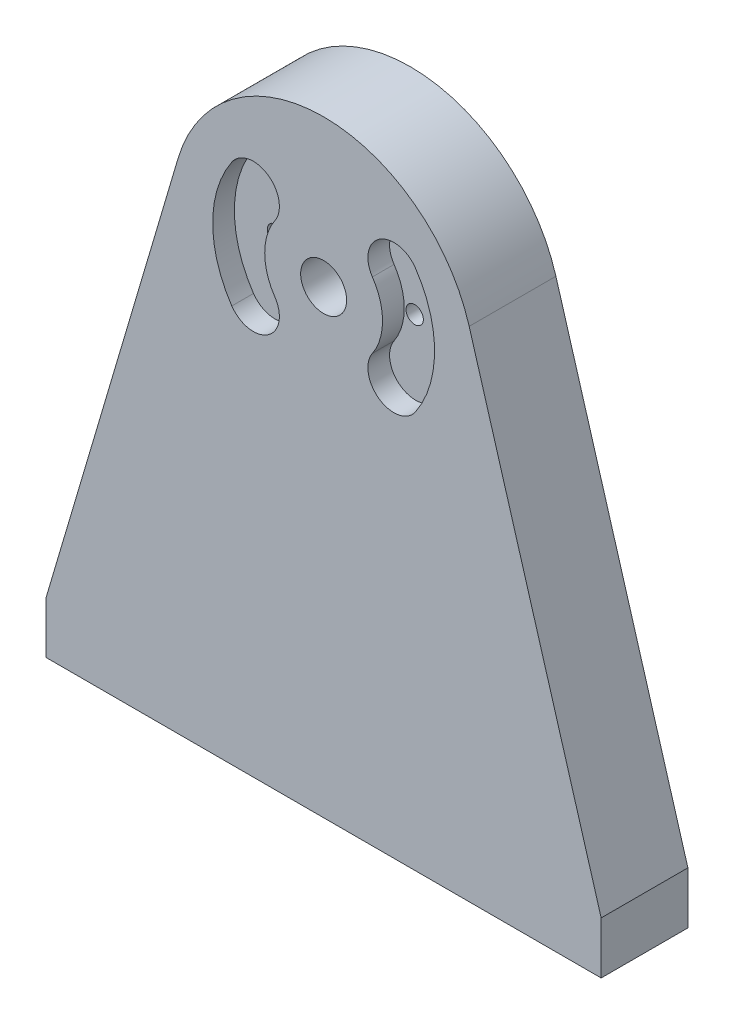
ISO-10303-21;
HEADER;
FILE_DESCRIPTION(('STEP AP214'),'2;1');
FILE_NAME('part.step','',(''),(''),'','','');
FILE_SCHEMA(('AUTOMOTIVE_DESIGN { 1 0 10303 214 1 1 1 1 }'));
ENDSEC;
DATA;
#1=APPLICATION_CONTEXT('core data for automotive mechanical design processes');
#2=APPLICATION_PROTOCOL_DEFINITION('international standard','automotive_design',2000,#1);
#3=PRODUCT_CONTEXT('',#1,'mechanical');
#4=PRODUCT('Part','Part','',(#3));
#5=PRODUCT_RELATED_PRODUCT_CATEGORY('part','',(#4));
#6=PRODUCT_DEFINITION_FORMATION('','',#4);
#7=PRODUCT_DEFINITION_CONTEXT('part definition',#1,'design');
#8=PRODUCT_DEFINITION('design','',#6,#7);
#9=PRODUCT_DEFINITION_SHAPE('','',#8);
#10=(LENGTH_UNIT() NAMED_UNIT(*) SI_UNIT(.MILLI.,.METRE.));
#11=(NAMED_UNIT(*) PLANE_ANGLE_UNIT() SI_UNIT($,.RADIAN.));
#12=(NAMED_UNIT(*) SI_UNIT($,.STERADIAN.) SOLID_ANGLE_UNIT());
#13=UNCERTAINTY_MEASURE_WITH_UNIT(LENGTH_MEASURE(1.E-05),#10,'distance_accuracy_value','');
#14=(GEOMETRIC_REPRESENTATION_CONTEXT(3) GLOBAL_UNCERTAINTY_ASSIGNED_CONTEXT((#13)) GLOBAL_UNIT_ASSIGNED_CONTEXT((#10,
#11,#12)) REPRESENTATION_CONTEXT('',''));
#15=CARTESIAN_POINT('',(0.,0.,0.));
#16=DIRECTION('',(0.,0.,1.));
#17=DIRECTION('',(1.,0.,0.));
#18=AXIS2_PLACEMENT_3D('',#15,#16,#17);
#19=CARTESIAN_POINT('',(0.,52.5,5.));
#20=DIRECTION('',(0.,0.,1.));
#21=DIRECTION('',(1.,0.,0.));
#22=AXIS2_PLACEMENT_3D('',#19,#20,#21);
#23=PLANE('',#22);
#24=CARTESIAN_POINT('',(-8.10334356909827,58.5,5.));
#25=DIRECTION('',(0.,0.,1.));
#26=DIRECTION('',(1.,0.,0.));
#27=AXIS2_PLACEMENT_3D('',#24,#25,#26);
#28=CIRCLE('',#27,3.);
#29=CARTESIAN_POINT('',(-5.62110165243839,56.8152225466915,5.));
#30=VERTEX_POINT('',#29);
#31=CARTESIAN_POINT('',(-10.5855854857581,60.1847774533085,5.));
#32=VERTEX_POINT('',#31);
#33=EDGE_CURVE('E261',#30,#32,#28,.T.);
#34=ORIENTED_EDGE('',*,*,#33,.F.);
#35=CARTESIAN_POINT('',(0.,53.,5.));
#36=DIRECTION('',(0.,0.,-1.));
#37=DIRECTION('',(1.,0.,0.));
#38=AXIS2_PLACEMENT_3D('',#35,#36,#37);
#39=CIRCLE('',#38,6.79357835516959);
#40=CARTESIAN_POINT('',(-5.62110165243839,49.1847774533085,5.));
#41=VERTEX_POINT('',#40);
#42=EDGE_CURVE('E325',#41,#30,#39,.T.);
#43=ORIENTED_EDGE('',*,*,#42,.F.);
#44=CARTESIAN_POINT('',(-8.10334356909827,47.5,5.));
#45=DIRECTION('',(0.,0.,1.));
#46=DIRECTION('',(1.,0.,0.));
#47=AXIS2_PLACEMENT_3D('',#44,#45,#46);
#48=CIRCLE('',#47,3.);
#49=CARTESIAN_POINT('',(-10.5855854857581,45.8152225466915,5.));
#50=VERTEX_POINT('',#49);
#51=EDGE_CURVE('E323',#50,#41,#48,.T.);
#52=ORIENTED_EDGE('',*,*,#51,.F.);
#53=CARTESIAN_POINT('',(0.,53.,5.));
#54=DIRECTION('',(0.,0.,1.));
#55=DIRECTION('',(1.,0.,0.));
#56=AXIS2_PLACEMENT_3D('',#53,#54,#55);
#57=CIRCLE('',#56,12.7935783551696);
#58=EDGE_CURVE('E312',#32,#50,#57,.T.);
#59=ORIENTED_EDGE('',*,*,#58,.F.);
#60=EDGE_LOOP('',(#34,#43,#52,#59));
#61=FACE_BOUND('',#60,.T.);
#62=CARTESIAN_POINT('',(0.,53.,5.));
#63=DIRECTION('',(0.,0.,1.));
#64=DIRECTION('',(1.,0.,0.));
#65=AXIS2_PLACEMENT_3D('',#62,#63,#64);
#66=CIRCLE('',#65,2.65);
#67=CARTESIAN_POINT('',(2.65,53.,5.));
#68=VERTEX_POINT('',#67);
#69=EDGE_CURVE('E332',#68,#68,#66,.T.);
#70=ORIENTED_EDGE('',*,*,#69,.F.);
#71=EDGE_LOOP('',(#70));
#72=FACE_BOUND('',#71,.T.);
#73=DIRECTION('',(0.,-1.,0.));
#74=VECTOR('',#73,1.);
#75=CARTESIAN_POINT('',(-32.,0.,5.));
#76=LINE('',#75,#74);
#77=CARTESIAN_POINT('',(-32.,6.,5.));
#78=VERTEX_POINT('',#77);
#79=CARTESIAN_POINT('',(-32.,0.,5.));
#80=VERTEX_POINT('',#79);
#81=EDGE_CURVE('E244',#78,#80,#76,.T.);
#82=ORIENTED_EDGE('',*,*,#81,.T.);
#83=DIRECTION('',(1.,0.,0.));
#84=VECTOR('',#83,1.);
#85=CARTESIAN_POINT('',(-32.,0.,5.));
#86=LINE('',#85,#84);
#87=CARTESIAN_POINT('',(32.,0.,5.));
#88=VERTEX_POINT('',#87);
#89=EDGE_CURVE('E343',#80,#88,#86,.T.);
#90=ORIENTED_EDGE('',*,*,#89,.T.);
#91=DIRECTION('',(0.,1.,0.));
#92=VECTOR('',#91,1.);
#93=CARTESIAN_POINT('',(32.,0.,5.));
#94=LINE('',#93,#92);
#95=CARTESIAN_POINT('',(32.,6.,5.));
#96=VERTEX_POINT('',#95);
#97=EDGE_CURVE('E230',#88,#96,#94,.T.);
#98=ORIENTED_EDGE('',*,*,#97,.T.);
#99=DIRECTION('',(-0.283577938554677,0.958949191962265,0.));
#100=VECTOR('',#99,1.);
#101=CARTESIAN_POINT('',(32.,6.,5.));
#102=LINE('',#101,#100);
#103=CARTESIAN_POINT('',(16.7816108593396,57.4626139247069,5.));
#104=VERTEX_POINT('',#103);
#105=EDGE_CURVE('E346',#96,#104,#102,.T.);
#106=ORIENTED_EDGE('',*,*,#105,.T.);
#107=CARTESIAN_POINT('',(0.,52.5,5.));
#108=DIRECTION('',(0.,0.,1.));
#109=DIRECTION('',(1.,0.,0.));
#110=AXIS2_PLACEMENT_3D('',#107,#108,#109);
#111=CIRCLE('',#110,17.5);
#112=CARTESIAN_POINT('',(-16.7816108593396,57.4626139247069,5.));
#113=VERTEX_POINT('',#112);
#114=EDGE_CURVE('E348',#104,#113,#111,.T.);
#115=ORIENTED_EDGE('',*,*,#114,.T.);
#116=DIRECTION('',(-0.283577938554677,-0.958949191962265,0.));
#117=VECTOR('',#116,1.);
#118=CARTESIAN_POINT('',(-32.,6.,5.));
#119=LINE('',#118,#117);
#120=EDGE_CURVE('E249',#113,#78,#119,.T.);
#121=ORIENTED_EDGE('',*,*,#120,.T.);
#122=EDGE_LOOP('',(#82,#90,#98,#106,#115,#121));
#123=FACE_BOUND('',#122,.T.);
#124=CARTESIAN_POINT('',(0.,53.,5.));
#125=DIRECTION('',(0.,0.,1.));
#126=DIRECTION('',(-1.,0.,0.));
#127=AXIS2_PLACEMENT_3D('',#124,#125,#126);
#128=CIRCLE('',#127,6.79357835516959);
#129=CARTESIAN_POINT('',(5.62110165243839,49.1847774533085,5.));
#130=VERTEX_POINT('',#129);
#131=CARTESIAN_POINT('',(5.62110165243839,56.8152225466915,5.));
#132=VERTEX_POINT('',#131);
#133=EDGE_CURVE('E364',#130,#132,#128,.T.);
#134=ORIENTED_EDGE('',*,*,#133,.T.);
#135=CARTESIAN_POINT('',(8.10334356909827,58.5,5.));
#136=DIRECTION('',(0.,0.,-1.));
#137=DIRECTION('',(-1.,0.,0.));
#138=AXIS2_PLACEMENT_3D('',#135,#136,#137);
#139=CIRCLE('',#138,3.);
#140=CARTESIAN_POINT('',(10.5855854857581,60.1847774533085,5.));
#141=VERTEX_POINT('',#140);
#142=EDGE_CURVE('E265',#132,#141,#139,.T.);
#143=ORIENTED_EDGE('',*,*,#142,.T.);
#144=CARTESIAN_POINT('',(0.,53.,5.));
#145=DIRECTION('',(0.,0.,-1.));
#146=DIRECTION('',(-1.,0.,0.));
#147=AXIS2_PLACEMENT_3D('',#144,#145,#146);
#148=CIRCLE('',#147,12.7935783551696);
#149=CARTESIAN_POINT('',(10.5855854857581,45.8152225466915,5.));
#150=VERTEX_POINT('',#149);
#151=EDGE_CURVE('E372',#141,#150,#148,.T.);
#152=ORIENTED_EDGE('',*,*,#151,.T.);
#153=CARTESIAN_POINT('',(8.10334356909827,47.5,5.));
#154=DIRECTION('',(0.,0.,-1.));
#155=DIRECTION('',(-1.,0.,0.));
#156=AXIS2_PLACEMENT_3D('',#153,#154,#155);
#157=CIRCLE('',#156,3.);
#158=EDGE_CURVE('E367',#150,#130,#157,.T.);
#159=ORIENTED_EDGE('',*,*,#158,.T.);
#160=EDGE_LOOP('',(#134,#143,#152,#159));
#161=FACE_BOUND('',#160,.T.);
#162=ADVANCED_FACE('F32',(#61,#72,#123,#161),#23,.T.);
#163=CARTESIAN_POINT('',(-32.,0.,5.));
#164=DIRECTION('',(1.,0.,0.));
#165=DIRECTION('',(0.,0.,-1.));
#166=AXIS2_PLACEMENT_3D('',#163,#164,#165);
#167=PLANE('',#166);
#168=DIRECTION('',(0.,-1.,0.));
#169=VECTOR('',#168,1.);
#170=CARTESIAN_POINT('',(-32.,0.,-5.));
#171=LINE('',#170,#169);
#172=CARTESIAN_POINT('',(-32.,6.,-5.));
#173=VERTEX_POINT('',#172);
#174=CARTESIAN_POINT('',(-32.,0.,-5.));
#175=VERTEX_POINT('',#174);
#176=EDGE_CURVE('E226',#173,#175,#171,.T.);
#177=ORIENTED_EDGE('',*,*,#176,.T.);
#178=DIRECTION('',(0.,0.,-1.));
#179=VECTOR('',#178,1.);
#180=CARTESIAN_POINT('',(-32.,0.,5.));
#181=LINE('',#180,#179);
#182=EDGE_CURVE('E220',#80,#175,#181,.T.);
#183=ORIENTED_EDGE('',*,*,#182,.F.);
#184=ORIENTED_EDGE('',*,*,#81,.F.);
#185=DIRECTION('',(0.,0.,-1.));
#186=VECTOR('',#185,1.);
#187=CARTESIAN_POINT('',(-32.,6.,5.));
#188=LINE('',#187,#186);
#189=EDGE_CURVE('E245',#78,#173,#188,.T.);
#190=ORIENTED_EDGE('',*,*,#189,.T.);
#191=EDGE_LOOP('',(#177,#183,#184,#190));
#192=FACE_BOUND('',#191,.T.);
#193=ADVANCED_FACE('F34',(#192),#167,.F.);
#194=CARTESIAN_POINT('',(-32.,0.,5.));
#195=DIRECTION('',(0.,1.,0.));
#196=DIRECTION('',(0.,0.,1.));
#197=AXIS2_PLACEMENT_3D('',#194,#195,#196);
#198=PLANE('',#197);
#199=CARTESIAN_POINT('',(22.,0.,0.));
#200=DIRECTION('',(0.,-1.,0.));
#201=DIRECTION('',(0.,0.,-1.));
#202=AXIS2_PLACEMENT_3D('',#199,#200,#201);
#203=CIRCLE('',#202,2.64999999999999);
#204=CARTESIAN_POINT('',(22.,0.,-2.64999999999999));
#205=VERTEX_POINT('',#204);
#206=EDGE_CURVE('E200',#205,#205,#203,.T.);
#207=ORIENTED_EDGE('',*,*,#206,.F.);
#208=EDGE_LOOP('',(#207));
#209=FACE_BOUND('',#208,.T.);
#210=CARTESIAN_POINT('',(-22.,0.,0.));
#211=DIRECTION('',(0.,-1.,0.));
#212=DIRECTION('',(0.,0.,-1.));
#213=AXIS2_PLACEMENT_3D('',#210,#211,#212);
#214=CIRCLE('',#213,2.64999999999999);
#215=CARTESIAN_POINT('',(-22.,0.,-2.65));
#216=VERTEX_POINT('',#215);
#217=EDGE_CURVE('E204',#216,#216,#214,.T.);
#218=ORIENTED_EDGE('',*,*,#217,.F.);
#219=EDGE_LOOP('',(#218));
#220=FACE_BOUND('',#219,.T.);
#221=CARTESIAN_POINT('',(8.,0.,0.));
#222=DIRECTION('',(0.,-1.,0.));
#223=DIRECTION('',(0.,0.,-1.));
#224=AXIS2_PLACEMENT_3D('',#221,#222,#223);
#225=CIRCLE('',#224,0.999999999999989);
#226=CARTESIAN_POINT('',(8.,0.,-0.999999999999989));
#227=VERTEX_POINT('',#226);
#228=EDGE_CURVE('E208',#227,#227,#225,.T.);
#229=ORIENTED_EDGE('',*,*,#228,.F.);
#230=EDGE_LOOP('',(#229));
#231=FACE_BOUND('',#230,.T.);
#232=CARTESIAN_POINT('',(-8.,0.,0.));
#233=DIRECTION('',(0.,-1.,0.));
#234=DIRECTION('',(0.,0.,-1.));
#235=AXIS2_PLACEMENT_3D('',#232,#233,#234);
#236=CIRCLE('',#235,0.999999999999989);
#237=CARTESIAN_POINT('',(-8.,0.,-0.999999999999991));
#238=VERTEX_POINT('',#237);
#239=EDGE_CURVE('E212',#238,#238,#236,.T.);
#240=ORIENTED_EDGE('',*,*,#239,.F.);
#241=EDGE_LOOP('',(#240));
#242=FACE_BOUND('',#241,.T.);
#243=DIRECTION('',(1.,0.,0.));
#244=VECTOR('',#243,1.);
#245=CARTESIAN_POINT('',(-32.,0.,-5.));
#246=LINE('',#245,#244);
#247=CARTESIAN_POINT('',(32.,0.,-5.));
#248=VERTEX_POINT('',#247);
#249=EDGE_CURVE('E215',#175,#248,#246,.T.);
#250=ORIENTED_EDGE('',*,*,#249,.T.);
#251=DIRECTION('',(0.,0.,-1.));
#252=VECTOR('',#251,1.);
#253=CARTESIAN_POINT('',(32.,0.,5.));
#254=LINE('',#253,#252);
#255=EDGE_CURVE('E217',#88,#248,#254,.T.);
#256=ORIENTED_EDGE('',*,*,#255,.F.);
#257=ORIENTED_EDGE('',*,*,#89,.F.);
#258=ORIENTED_EDGE('',*,*,#182,.T.);
#259=EDGE_LOOP('',(#250,#256,#257,#258));
#260=FACE_BOUND('',#259,.T.);
#261=ADVANCED_FACE('F166',(#209,#220,#231,#242,#260),#198,.F.);
#262=CARTESIAN_POINT('',(32.,0.,5.));
#263=DIRECTION('',(-1.,0.,0.));
#264=DIRECTION('',(0.,0.,1.));
#265=AXIS2_PLACEMENT_3D('',#262,#263,#264);
#266=PLANE('',#265);
#267=DIRECTION('',(0.,1.,0.));
#268=VECTOR('',#267,1.);
#269=CARTESIAN_POINT('',(32.,0.,-5.));
#270=LINE('',#269,#268);
#271=CARTESIAN_POINT('',(32.,6.,-5.));
#272=VERTEX_POINT('',#271);
#273=EDGE_CURVE('E225',#248,#272,#270,.T.);
#274=ORIENTED_EDGE('',*,*,#273,.T.);
#275=DIRECTION('',(0.,0.,-1.));
#276=VECTOR('',#275,1.);
#277=CARTESIAN_POINT('',(32.,6.,5.));
#278=LINE('',#277,#276);
#279=EDGE_CURVE('E231',#96,#272,#278,.T.);
#280=ORIENTED_EDGE('',*,*,#279,.F.);
#281=ORIENTED_EDGE('',*,*,#97,.F.);
#282=ORIENTED_EDGE('',*,*,#255,.T.);
#283=EDGE_LOOP('',(#274,#280,#281,#282));
#284=FACE_BOUND('',#283,.T.);
#285=ADVANCED_FACE('F189',(#284),#266,.F.);
#286=CARTESIAN_POINT('',(32.,6.,5.));
#287=DIRECTION('',(-0.958949191962265,-0.283577938554677,0.));
#288=DIRECTION('',(0.283577938554677,-0.958949191962265,0.));
#289=AXIS2_PLACEMENT_3D('',#286,#287,#288);
#290=PLANE('',#289);
#291=DIRECTION('',(-0.283577938554677,0.958949191962265,0.));
#292=VECTOR('',#291,1.);
#293=CARTESIAN_POINT('',(32.,6.,-5.));
#294=LINE('',#293,#292);
#295=CARTESIAN_POINT('',(16.7816108593396,57.4626139247069,-5.));
#296=VERTEX_POINT('',#295);
#297=EDGE_CURVE('E235',#272,#296,#294,.T.);
#298=ORIENTED_EDGE('',*,*,#297,.T.);
#299=DIRECTION('',(0.,0.,-1.));
#300=VECTOR('',#299,1.);
#301=CARTESIAN_POINT('',(16.7816108593396,57.4626139247069,5.));
#302=LINE('',#301,#300);
#303=EDGE_CURVE('E252',#104,#296,#302,.T.);
#304=ORIENTED_EDGE('',*,*,#303,.F.);
#305=ORIENTED_EDGE('',*,*,#105,.F.);
#306=ORIENTED_EDGE('',*,*,#279,.T.);
#307=EDGE_LOOP('',(#298,#304,#305,#306));
#308=FACE_BOUND('',#307,.T.);
#309=ADVANCED_FACE('F185',(#308),#290,.F.);
#310=CARTESIAN_POINT('',(0.,52.5,5.));
#311=DIRECTION('',(0.,0.,-1.));
#312=DIRECTION('',(-1.,0.,0.));
#313=AXIS2_PLACEMENT_3D('',#310,#311,#312);
#314=CYLINDRICAL_SURFACE('',#313,17.5);
#315=CARTESIAN_POINT('',(0.,52.5,-5.));
#316=DIRECTION('',(0.,0.,1.));
#317=DIRECTION('',(1.,0.,0.));
#318=AXIS2_PLACEMENT_3D('',#315,#316,#317);
#319=CIRCLE('',#318,17.5);
#320=CARTESIAN_POINT('',(-16.7816108593396,57.4626139247069,-5.));
#321=VERTEX_POINT('',#320);
#322=EDGE_CURVE('E237',#296,#321,#319,.T.);
#323=ORIENTED_EDGE('',*,*,#322,.T.);
#324=DIRECTION('',(0.,0.,-1.));
#325=VECTOR('',#324,1.);
#326=CARTESIAN_POINT('',(-16.7816108593396,57.4626139247069,5.));
#327=LINE('',#326,#325);
#328=EDGE_CURVE('E248',#113,#321,#327,.T.);
#329=ORIENTED_EDGE('',*,*,#328,.F.);
#330=ORIENTED_EDGE('',*,*,#114,.F.);
#331=ORIENTED_EDGE('',*,*,#303,.T.);
#332=EDGE_LOOP('',(#323,#329,#330,#331));
#333=FACE_BOUND('',#332,.T.);
#334=ADVANCED_FACE('F181',(#333),#314,.T.);
#335=CARTESIAN_POINT('',(-32.,6.,5.));
#336=DIRECTION('',(0.958949191962265,-0.283577938554677,0.));
#337=DIRECTION('',(0.283577938554677,0.958949191962265,0.));
#338=AXIS2_PLACEMENT_3D('',#335,#336,#337);
#339=PLANE('',#338);
#340=DIRECTION('',(-0.283577938554677,-0.958949191962265,0.));
#341=VECTOR('',#340,1.);
#342=CARTESIAN_POINT('',(-32.,6.,-5.));
#343=LINE('',#342,#341);
#344=EDGE_CURVE('E242',#321,#173,#343,.T.);
#345=ORIENTED_EDGE('',*,*,#344,.T.);
#346=ORIENTED_EDGE('',*,*,#189,.F.);
#347=ORIENTED_EDGE('',*,*,#120,.F.);
#348=ORIENTED_EDGE('',*,*,#328,.T.);
#349=EDGE_LOOP('',(#345,#346,#347,#348));
#350=FACE_BOUND('',#349,.T.);
#351=ADVANCED_FACE('F177',(#350),#339,.F.);
#352=CARTESIAN_POINT('',(0.,52.5,-5.));
#353=DIRECTION('',(0.,0.,1.));
#354=DIRECTION('',(1.,0.,0.));
#355=AXIS2_PLACEMENT_3D('',#352,#353,#354);
#356=PLANE('',#355);
#357=CARTESIAN_POINT('',(0.,53.,-5.));
#358=DIRECTION('',(0.,0.,1.));
#359=DIRECTION('',(1.,0.,0.));
#360=AXIS2_PLACEMENT_3D('',#357,#358,#359);
#361=CIRCLE('',#360,2.65);
#362=CARTESIAN_POINT('',(2.65,53.,-5.));
#363=VERTEX_POINT('',#362);
#364=EDGE_CURVE('E338',#363,#363,#361,.T.);
#365=ORIENTED_EDGE('',*,*,#364,.T.);
#366=EDGE_LOOP('',(#365));
#367=FACE_BOUND('',#366,.T.);
#368=ORIENTED_EDGE('',*,*,#176,.F.);
#369=ORIENTED_EDGE('',*,*,#344,.F.);
#370=ORIENTED_EDGE('',*,*,#322,.F.);
#371=ORIENTED_EDGE('',*,*,#297,.F.);
#372=ORIENTED_EDGE('',*,*,#273,.F.);
#373=ORIENTED_EDGE('',*,*,#249,.F.);
#374=EDGE_LOOP('',(#368,#369,#370,#371,#372,#373));
#375=FACE_BOUND('',#374,.T.);
#376=ADVANCED_FACE('F174',(#367,#375),#356,.F.);
#377=CARTESIAN_POINT('',(0.,53.,5.));
#378=DIRECTION('',(0.,0.,1.));
#379=DIRECTION('',(1.,0.,0.));
#380=AXIS2_PLACEMENT_3D('',#377,#378,#379);
#381=CYLINDRICAL_SURFACE('',#380,2.65);
#382=ORIENTED_EDGE('',*,*,#364,.F.);
#383=EDGE_LOOP('',(#382));
#384=FACE_BOUND('',#383,.T.);
#385=ORIENTED_EDGE('',*,*,#69,.T.);
#386=EDGE_LOOP('',(#385));
#387=FACE_BOUND('',#386,.T.);
#388=ADVANCED_FACE('F172',(#384,#387),#381,.F.);
#389=CARTESIAN_POINT('',(-8.10334356909827,58.5,2.5));
#390=DIRECTION('',(0.,0.,1.));
#391=DIRECTION('',(1.,0.,0.));
#392=AXIS2_PLACEMENT_3D('',#389,#390,#391);
#393=CYLINDRICAL_SURFACE('',#392,3.);
#394=ORIENTED_EDGE('',*,*,#33,.T.);
#395=DIRECTION('',(0.,0.,1.));
#396=VECTOR('',#395,1.);
#397=CARTESIAN_POINT('',(-10.5855854857581,60.1847774533085,2.5));
#398=LINE('',#397,#396);
#399=CARTESIAN_POINT('',(-10.5855854857581,60.1847774533085,2.5));
#400=VERTEX_POINT('',#399);
#401=EDGE_CURVE('E306',#400,#32,#398,.T.);
#402=ORIENTED_EDGE('',*,*,#401,.F.);
#403=CARTESIAN_POINT('',(-8.10334356909827,58.5,2.5));
#404=DIRECTION('',(0.,0.,1.));
#405=DIRECTION('',(1.,0.,0.));
#406=AXIS2_PLACEMENT_3D('',#403,#404,#405);
#407=CIRCLE('',#406,3.);
#408=CARTESIAN_POINT('',(-5.62110165243839,56.8152225466915,2.5));
#409=VERTEX_POINT('',#408);
#410=EDGE_CURVE('E330',#409,#400,#407,.T.);
#411=ORIENTED_EDGE('',*,*,#410,.F.);
#412=DIRECTION('',(0.,0.,1.));
#413=VECTOR('',#412,1.);
#414=CARTESIAN_POINT('',(-5.62110165243839,56.8152225466915,2.5));
#415=LINE('',#414,#413);
#416=EDGE_CURVE('E308',#409,#30,#415,.T.);
#417=ORIENTED_EDGE('',*,*,#416,.T.);
#418=EDGE_LOOP('',(#394,#402,#411,#417));
#419=FACE_BOUND('',#418,.T.);
#420=ADVANCED_FACE('F291',(#419),#393,.F.);
#421=CARTESIAN_POINT('',(0.,53.,2.5));
#422=DIRECTION('',(0.,0.,1.));
#423=DIRECTION('',(1.,0.,0.));
#424=AXIS2_PLACEMENT_3D('',#421,#422,#423);
#425=CYLINDRICAL_SURFACE('',#424,6.79357835516959);
#426=ORIENTED_EDGE('',*,*,#42,.T.);
#427=ORIENTED_EDGE('',*,*,#416,.F.);
#428=CARTESIAN_POINT('',(0.,53.,2.5));
#429=DIRECTION('',(0.,0.,-1.));
#430=DIRECTION('',(1.,0.,0.));
#431=AXIS2_PLACEMENT_3D('',#428,#429,#430);
#432=CIRCLE('',#431,6.79357835516959);
#433=CARTESIAN_POINT('',(-5.62110165243839,49.1847774533085,2.5));
#434=VERTEX_POINT('',#433);
#435=EDGE_CURVE('E320',#434,#409,#432,.T.);
#436=ORIENTED_EDGE('',*,*,#435,.F.);
#437=DIRECTION('',(0.,0.,1.));
#438=VECTOR('',#437,1.);
#439=CARTESIAN_POINT('',(-5.62110165243839,49.1847774533085,2.5));
#440=LINE('',#439,#438);
#441=EDGE_CURVE('E333',#434,#41,#440,.T.);
#442=ORIENTED_EDGE('',*,*,#441,.T.);
#443=EDGE_LOOP('',(#426,#427,#436,#442));
#444=FACE_BOUND('',#443,.T.);
#445=ADVANCED_FACE('F287',(#444),#425,.T.);
#446=CARTESIAN_POINT('',(-8.10334356909827,47.5,2.5));
#447=DIRECTION('',(0.,0.,1.));
#448=DIRECTION('',(1.,0.,0.));
#449=AXIS2_PLACEMENT_3D('',#446,#447,#448);
#450=CYLINDRICAL_SURFACE('',#449,3.);
#451=ORIENTED_EDGE('',*,*,#51,.T.);
#452=ORIENTED_EDGE('',*,*,#441,.F.);
#453=CARTESIAN_POINT('',(-8.10334356909827,47.5,2.5));
#454=DIRECTION('',(0.,0.,1.));
#455=DIRECTION('',(1.,0.,0.));
#456=AXIS2_PLACEMENT_3D('',#453,#454,#455);
#457=CIRCLE('',#456,3.);
#458=CARTESIAN_POINT('',(-10.5855854857581,45.8152225466915,2.5));
#459=VERTEX_POINT('',#458);
#460=EDGE_CURVE('E390',#459,#434,#457,.T.);
#461=ORIENTED_EDGE('',*,*,#460,.F.);
#462=DIRECTION('',(0.,0.,1.));
#463=VECTOR('',#462,1.);
#464=CARTESIAN_POINT('',(-10.5855854857581,45.8152225466915,2.5));
#465=LINE('',#464,#463);
#466=EDGE_CURVE('E319',#459,#50,#465,.T.);
#467=ORIENTED_EDGE('',*,*,#466,.T.);
#468=EDGE_LOOP('',(#451,#452,#461,#467));
#469=FACE_BOUND('',#468,.T.);
#470=ADVANCED_FACE('F290',(#469),#450,.F.);
#471=CARTESIAN_POINT('',(0.,53.,2.5));
#472=DIRECTION('',(0.,0.,1.));
#473=DIRECTION('',(1.,0.,0.));
#474=AXIS2_PLACEMENT_3D('',#471,#472,#473);
#475=CYLINDRICAL_SURFACE('',#474,12.7935783551696);
#476=ORIENTED_EDGE('',*,*,#58,.T.);
#477=ORIENTED_EDGE('',*,*,#466,.F.);
#478=CARTESIAN_POINT('',(0.,53.,2.5));
#479=DIRECTION('',(0.,0.,1.));
#480=DIRECTION('',(1.,0.,0.));
#481=AXIS2_PLACEMENT_3D('',#478,#479,#480);
#482=CIRCLE('',#481,12.7935783551696);
#483=EDGE_CURVE('E317',#400,#459,#482,.T.);
#484=ORIENTED_EDGE('',*,*,#483,.F.);
#485=ORIENTED_EDGE('',*,*,#401,.T.);
#486=EDGE_LOOP('',(#476,#477,#484,#485));
#487=FACE_BOUND('',#486,.T.);
#488=ADVANCED_FACE('F282',(#487),#475,.F.);
#489=CARTESIAN_POINT('',(-4.05167178454913,55.75,2.5));
#490=DIRECTION('',(0.,0.,1.));
#491=DIRECTION('',(1.,0.,0.));
#492=AXIS2_PLACEMENT_3D('',#489,#490,#491);
#493=PLANE('',#492);
#494=CARTESIAN_POINT('',(-8.,53.,2.5));
#495=DIRECTION('',(0.,0.,1.));
#496=DIRECTION('',(1.,0.,0.));
#497=AXIS2_PLACEMENT_3D('',#494,#495,#496);
#498=CIRCLE('',#497,0.999999999999988);
#499=CARTESIAN_POINT('',(-7.00000000000001,53.,2.5));
#500=VERTEX_POINT('',#499);
#501=EDGE_CURVE('E258',#500,#500,#498,.T.);
#502=ORIENTED_EDGE('',*,*,#501,.F.);
#503=EDGE_LOOP('',(#502));
#504=FACE_BOUND('',#503,.T.);
#505=ORIENTED_EDGE('',*,*,#410,.T.);
#506=ORIENTED_EDGE('',*,*,#483,.T.);
#507=ORIENTED_EDGE('',*,*,#460,.T.);
#508=ORIENTED_EDGE('',*,*,#435,.T.);
#509=EDGE_LOOP('',(#505,#506,#507,#508));
#510=FACE_BOUND('',#509,.T.);
#511=ADVANCED_FACE('F272',(#504,#510),#493,.T.);
#512=CARTESIAN_POINT('',(-8.,53.,5.));
#513=DIRECTION('',(0.,0.,1.));
#514=DIRECTION('',(1.,0.,0.));
#515=AXIS2_PLACEMENT_3D('',#512,#513,#514);
#516=CYLINDRICAL_SURFACE('',#515,0.999999999999988);
#517=ORIENTED_EDGE('',*,*,#501,.T.);
#518=EDGE_LOOP('',(#517));
#519=FACE_BOUND('',#518,.T.);
#520=CARTESIAN_POINT('',(-8.,53.,0.));
#521=DIRECTION('',(0.,0.707106781186547,0.707106781186547));
#522=DIRECTION('',(0.,-0.707106781186547,0.707106781186547));
#523=AXIS2_PLACEMENT_3D('',#520,#521,#522);
#524=ELLIPSE('',#523,1.41421356237308,0.999999999999989);
#525=CARTESIAN_POINT('',(-7.00000000000001,53.,0.));
#526=VERTEX_POINT('',#525);
#527=CARTESIAN_POINT('',(-8.99999999999999,53.,0.));
#528=VERTEX_POINT('',#527);
#529=EDGE_CURVE('E257',#526,#528,#524,.F.);
#530=ORIENTED_EDGE('',*,*,#529,.T.);
#531=CARTESIAN_POINT('',(-8.,53.,0.));
#532=DIRECTION('',(0.,-0.707106781186547,0.707106781186547));
#533=DIRECTION('',(0.,0.707106781186547,0.707106781186547));
#534=AXIS2_PLACEMENT_3D('',#531,#532,#533);
#535=ELLIPSE('',#534,1.41421356237308,0.999999999999989);
#536=EDGE_CURVE('E51',#528,#526,#535,.F.);
#537=ORIENTED_EDGE('',*,*,#536,.T.);
#538=EDGE_LOOP('',(#530,#537));
#539=FACE_BOUND('',#538,.T.);
#540=ADVANCED_FACE('F269',(#519,#539),#516,.F.);
#541=CARTESIAN_POINT('',(8.10334356909827,58.5,2.5));
#542=DIRECTION('',(0.,0.,1.));
#543=DIRECTION('',(1.,0.,0.));
#544=AXIS2_PLACEMENT_3D('',#541,#542,#543);
#545=CYLINDRICAL_SURFACE('',#544,3.);
#546=ORIENTED_EDGE('',*,*,#142,.F.);
#547=DIRECTION('',(0.,0.,1.));
#548=VECTOR('',#547,1.);
#549=CARTESIAN_POINT('',(5.62110165243839,56.8152225466915,2.5));
#550=LINE('',#549,#548);
#551=CARTESIAN_POINT('',(5.62110165243839,56.8152225466915,2.5));
#552=VERTEX_POINT('',#551);
#553=EDGE_CURVE('E385',#552,#132,#550,.T.);
#554=ORIENTED_EDGE('',*,*,#553,.F.);
#555=CARTESIAN_POINT('',(8.10334356909827,58.5,2.5));
#556=DIRECTION('',(0.,0.,-1.));
#557=DIRECTION('',(-1.,0.,0.));
#558=AXIS2_PLACEMENT_3D('',#555,#556,#557);
#559=CIRCLE('',#558,3.);
#560=CARTESIAN_POINT('',(10.5855854857581,60.1847774533085,2.5));
#561=VERTEX_POINT('',#560);
#562=EDGE_CURVE('E378',#552,#561,#559,.T.);
#563=ORIENTED_EDGE('',*,*,#562,.T.);
#564=DIRECTION('',(0.,0.,1.));
#565=VECTOR('',#564,1.);
#566=CARTESIAN_POINT('',(10.5855854857581,60.1847774533085,2.5));
#567=LINE('',#566,#565);
#568=EDGE_CURVE('E262',#561,#141,#567,.T.);
#569=ORIENTED_EDGE('',*,*,#568,.T.);
#570=EDGE_LOOP('',(#546,#554,#563,#569));
#571=FACE_BOUND('',#570,.T.);
#572=ADVANCED_FACE('F271',(#571),#545,.F.);
#573=CARTESIAN_POINT('',(0.,53.,2.5));
#574=DIRECTION('',(0.,0.,1.));
#575=DIRECTION('',(1.,0.,0.));
#576=AXIS2_PLACEMENT_3D('',#573,#574,#575);
#577=CYLINDRICAL_SURFACE('',#576,12.7935783551696);
#578=ORIENTED_EDGE('',*,*,#151,.F.);
#579=ORIENTED_EDGE('',*,*,#568,.F.);
#580=CARTESIAN_POINT('',(0.,53.,2.5));
#581=DIRECTION('',(0.,0.,-1.));
#582=DIRECTION('',(-1.,0.,0.));
#583=AXIS2_PLACEMENT_3D('',#580,#581,#582);
#584=CIRCLE('',#583,12.7935783551696);
#585=CARTESIAN_POINT('',(10.5855854857581,45.8152225466915,2.5));
#586=VERTEX_POINT('',#585);
#587=EDGE_CURVE('E387',#561,#586,#584,.T.);
#588=ORIENTED_EDGE('',*,*,#587,.T.);
#589=DIRECTION('',(0.,0.,1.));
#590=VECTOR('',#589,1.);
#591=CARTESIAN_POINT('',(10.5855854857581,45.8152225466915,2.5));
#592=LINE('',#591,#590);
#593=EDGE_CURVE('E381',#586,#150,#592,.T.);
#594=ORIENTED_EDGE('',*,*,#593,.T.);
#595=EDGE_LOOP('',(#578,#579,#588,#594));
#596=FACE_BOUND('',#595,.T.);
#597=ADVANCED_FACE('F279',(#596),#577,.F.);
#598=CARTESIAN_POINT('',(8.10334356909827,47.5,2.5));
#599=DIRECTION('',(0.,0.,1.));
#600=DIRECTION('',(1.,0.,0.));
#601=AXIS2_PLACEMENT_3D('',#598,#599,#600);
#602=CYLINDRICAL_SURFACE('',#601,3.);
#603=ORIENTED_EDGE('',*,*,#158,.F.);
#604=ORIENTED_EDGE('',*,*,#593,.F.);
#605=CARTESIAN_POINT('',(8.10334356909827,47.5,2.5));
#606=DIRECTION('',(0.,0.,-1.));
#607=DIRECTION('',(-1.,0.,0.));
#608=AXIS2_PLACEMENT_3D('',#605,#606,#607);
#609=CIRCLE('',#608,3.);
#610=CARTESIAN_POINT('',(5.62110165243839,49.1847774533085,2.5));
#611=VERTEX_POINT('',#610);
#612=EDGE_CURVE('E397',#586,#611,#609,.T.);
#613=ORIENTED_EDGE('',*,*,#612,.T.);
#614=DIRECTION('',(0.,0.,1.));
#615=VECTOR('',#614,1.);
#616=CARTESIAN_POINT('',(5.62110165243839,49.1847774533085,2.5));
#617=LINE('',#616,#615);
#618=EDGE_CURVE('E383',#611,#130,#617,.T.);
#619=ORIENTED_EDGE('',*,*,#618,.T.);
#620=EDGE_LOOP('',(#603,#604,#613,#619));
#621=FACE_BOUND('',#620,.T.);
#622=ADVANCED_FACE('F513',(#621),#602,.F.);
#623=CARTESIAN_POINT('',(0.,53.,2.5));
#624=DIRECTION('',(0.,0.,1.));
#625=DIRECTION('',(1.,0.,0.));
#626=AXIS2_PLACEMENT_3D('',#623,#624,#625);
#627=CYLINDRICAL_SURFACE('',#626,6.79357835516959);
#628=ORIENTED_EDGE('',*,*,#133,.F.);
#629=ORIENTED_EDGE('',*,*,#618,.F.);
#630=CARTESIAN_POINT('',(0.,53.,2.5));
#631=DIRECTION('',(0.,0.,1.));
#632=DIRECTION('',(-1.,0.,0.));
#633=AXIS2_PLACEMENT_3D('',#630,#631,#632);
#634=CIRCLE('',#633,6.79357835516959);
#635=EDGE_CURVE('E401',#611,#552,#634,.T.);
#636=ORIENTED_EDGE('',*,*,#635,.T.);
#637=ORIENTED_EDGE('',*,*,#553,.T.);
#638=EDGE_LOOP('',(#628,#629,#636,#637));
#639=FACE_BOUND('',#638,.T.);
#640=ADVANCED_FACE('F155',(#639),#627,.T.);
#641=CARTESIAN_POINT('',(4.05167178454913,55.75,2.5));
#642=DIRECTION('',(0.,0.,1.));
#643=DIRECTION('',(-1.,0.,0.));
#644=AXIS2_PLACEMENT_3D('',#641,#642,#643);
#645=PLANE('',#644);
#646=CARTESIAN_POINT('',(8.,53.,2.5));
#647=DIRECTION('',(0.,0.,1.));
#648=DIRECTION('',(1.,0.,0.));
#649=AXIS2_PLACEMENT_3D('',#646,#647,#648);
#650=CIRCLE('',#649,0.999999999999988);
#651=CARTESIAN_POINT('',(8.99999999999999,53.,2.5));
#652=VERTEX_POINT('',#651);
#653=EDGE_CURVE('E263',#652,#652,#650,.T.);
#654=ORIENTED_EDGE('',*,*,#653,.F.);
#655=EDGE_LOOP('',(#654));
#656=FACE_BOUND('',#655,.T.);
#657=ORIENTED_EDGE('',*,*,#562,.F.);
#658=ORIENTED_EDGE('',*,*,#635,.F.);
#659=ORIENTED_EDGE('',*,*,#612,.F.);
#660=ORIENTED_EDGE('',*,*,#587,.F.);
#661=EDGE_LOOP('',(#657,#658,#659,#660));
#662=FACE_BOUND('',#661,.T.);
#663=ADVANCED_FACE('F145',(#656,#662),#645,.T.);
#664=CARTESIAN_POINT('',(8.,53.,5.));
#665=DIRECTION('',(0.,0.,1.));
#666=DIRECTION('',(1.,0.,0.));
#667=AXIS2_PLACEMENT_3D('',#664,#665,#666);
#668=CYLINDRICAL_SURFACE('',#667,0.999999999999988);
#669=ORIENTED_EDGE('',*,*,#653,.T.);
#670=EDGE_LOOP('',(#669));
#671=FACE_BOUND('',#670,.T.);
#672=CARTESIAN_POINT('',(8.,53.,0.));
#673=DIRECTION('',(0.,0.707106781186547,0.707106781186547));
#674=DIRECTION('',(0.,-0.707106781186547,0.707106781186547));
#675=AXIS2_PLACEMENT_3D('',#672,#673,#674);
#676=ELLIPSE('',#675,1.41421356237308,0.999999999999989);
#677=CARTESIAN_POINT('',(8.99999999999999,53.,0.));
#678=VERTEX_POINT('',#677);
#679=CARTESIAN_POINT('',(7.00000000000001,53.,0.));
#680=VERTEX_POINT('',#679);
#681=EDGE_CURVE('E40',#678,#680,#676,.F.);
#682=ORIENTED_EDGE('',*,*,#681,.T.);
#683=CARTESIAN_POINT('',(8.,53.,0.));
#684=DIRECTION('',(0.,-0.707106781186547,0.707106781186547));
#685=DIRECTION('',(0.,0.707106781186547,0.707106781186547));
#686=AXIS2_PLACEMENT_3D('',#683,#684,#685);
#687=ELLIPSE('',#686,1.41421356237308,0.999999999999989);
#688=EDGE_CURVE('E11',#680,#678,#687,.F.);
#689=ORIENTED_EDGE('',*,*,#688,.T.);
#690=EDGE_LOOP('',(#682,#689));
#691=FACE_BOUND('',#690,.T.);
#692=ADVANCED_FACE('F142',(#671,#691),#668,.F.);
#693=CARTESIAN_POINT('',(-8.,0.,0.));
#694=DIRECTION('',(0.,-1.,0.));
#695=DIRECTION('',(0.,0.,-1.));
#696=AXIS2_PLACEMENT_3D('',#693,#694,#695);
#697=CYLINDRICAL_SURFACE('',#696,0.99999999999999);
#698=CARTESIAN_POINT('',(-8.,55.,0.));
#699=DIRECTION('',(0.,-1.,0.));
#700=DIRECTION('',(0.,0.,-1.));
#701=AXIS2_PLACEMENT_3D('',#698,#699,#700);
#702=CIRCLE('',#701,0.999999999999992);
#703=CARTESIAN_POINT('',(-8.,55.,-0.999999999999994));
#704=VERTEX_POINT('',#703);
#705=EDGE_CURVE('E266',#704,#704,#702,.T.);
#706=ORIENTED_EDGE('',*,*,#705,.F.);
#707=EDGE_LOOP('',(#706));
#708=FACE_BOUND('',#707,.T.);
#709=ORIENTED_EDGE('',*,*,#239,.T.);
#710=EDGE_LOOP('',(#709));
#711=FACE_BOUND('',#710,.T.);
#712=ORIENTED_EDGE('',*,*,#529,.F.);
#713=ORIENTED_EDGE('',*,*,#536,.F.);
#714=EDGE_LOOP('',(#712,#713));
#715=FACE_BOUND('',#714,.T.);
#716=ADVANCED_FACE('F144',(#708,#711,#715),#697,.F.);
#717=CARTESIAN_POINT('',(-8.00000000000001,55.,0.));
#718=DIRECTION('',(0.,1.,0.));
#719=DIRECTION('',(0.,0.,1.));
#720=AXIS2_PLACEMENT_3D('',#717,#718,#719);
#721=PLANE('',#720);
#722=ORIENTED_EDGE('',*,*,#705,.T.);
#723=EDGE_LOOP('',(#722));
#724=FACE_BOUND('',#723,.T.);
#725=ADVANCED_FACE('F152',(#724),#721,.F.);
#726=CARTESIAN_POINT('',(8.,0.,0.));
#727=DIRECTION('',(0.,-1.,0.));
#728=DIRECTION('',(0.,0.,-1.));
#729=AXIS2_PLACEMENT_3D('',#726,#727,#728);
#730=CYLINDRICAL_SURFACE('',#729,0.99999999999999);
#731=CARTESIAN_POINT('',(8.,55.,0.));
#732=DIRECTION('',(0.,-1.,0.));
#733=DIRECTION('',(0.,0.,-1.));
#734=AXIS2_PLACEMENT_3D('',#731,#732,#733);
#735=CIRCLE('',#734,0.999999999999992);
#736=CARTESIAN_POINT('',(8.,55.,-0.999999999999992));
#737=VERTEX_POINT('',#736);
#738=EDGE_CURVE('E410',#737,#737,#735,.T.);
#739=ORIENTED_EDGE('',*,*,#738,.F.);
#740=EDGE_LOOP('',(#739));
#741=FACE_BOUND('',#740,.T.);
#742=ORIENTED_EDGE('',*,*,#228,.T.);
#743=EDGE_LOOP('',(#742));
#744=FACE_BOUND('',#743,.T.);
#745=ORIENTED_EDGE('',*,*,#681,.F.);
#746=ORIENTED_EDGE('',*,*,#688,.F.);
#747=EDGE_LOOP('',(#745,#746));
#748=FACE_BOUND('',#747,.T.);
#749=ADVANCED_FACE('F140',(#741,#744,#748),#730,.F.);
#750=CARTESIAN_POINT('',(7.99999999999999,55.,0.));
#751=DIRECTION('',(0.,1.,0.));
#752=DIRECTION('',(0.,0.,1.));
#753=AXIS2_PLACEMENT_3D('',#750,#751,#752);
#754=PLANE('',#753);
#755=ORIENTED_EDGE('',*,*,#738,.T.);
#756=EDGE_LOOP('',(#755));
#757=FACE_BOUND('',#756,.T.);
#758=ADVANCED_FACE('F441',(#757),#754,.F.);
#759=CARTESIAN_POINT('',(-22.,12.4,0.));
#760=DIRECTION('',(0.,1.,0.));
#761=DIRECTION('',(0.,0.,1.));
#762=AXIS2_PLACEMENT_3D('',#759,#760,#761);
#763=PLANE('',#762);
#764=CARTESIAN_POINT('',(-22.,12.4,0.));
#765=DIRECTION('',(0.,-1.,0.));
#766=DIRECTION('',(0.,0.,-1.));
#767=AXIS2_PLACEMENT_3D('',#764,#765,#766);
#768=CIRCLE('',#767,2.64999999999999);
#769=CARTESIAN_POINT('',(-22.,12.4,-2.65));
#770=VERTEX_POINT('',#769);
#771=EDGE_CURVE('E414',#770,#770,#768,.T.);
#772=ORIENTED_EDGE('',*,*,#771,.T.);
#773=EDGE_LOOP('',(#772));
#774=FACE_BOUND('',#773,.T.);
#775=ADVANCED_FACE('F437',(#774),#763,.F.);
#776=CARTESIAN_POINT('',(-22.,0.,0.));
#777=DIRECTION('',(0.,-1.,0.));
#778=DIRECTION('',(0.,0.,-1.));
#779=AXIS2_PLACEMENT_3D('',#776,#777,#778);
#780=CYLINDRICAL_SURFACE('',#779,2.64999999999999);
#781=ORIENTED_EDGE('',*,*,#771,.F.);
#782=EDGE_LOOP('',(#781));
#783=FACE_BOUND('',#782,.T.);
#784=ORIENTED_EDGE('',*,*,#217,.T.);
#785=EDGE_LOOP('',(#784));
#786=FACE_BOUND('',#785,.T.);
#787=ADVANCED_FACE('F430',(#783,#786),#780,.F.);
#788=CARTESIAN_POINT('',(22.,12.4,0.));
#789=DIRECTION('',(0.,1.,0.));
#790=DIRECTION('',(0.,0.,1.));
#791=AXIS2_PLACEMENT_3D('',#788,#789,#790);
#792=PLANE('',#791);
#793=CARTESIAN_POINT('',(22.,12.4,0.));
#794=DIRECTION('',(0.,-1.,0.));
#795=DIRECTION('',(0.,0.,-1.));
#796=AXIS2_PLACEMENT_3D('',#793,#794,#795);
#797=CIRCLE('',#796,2.64999999999999);
#798=CARTESIAN_POINT('',(22.,12.4,-2.64999999999999));
#799=VERTEX_POINT('',#798);
#800=EDGE_CURVE('E418',#799,#799,#797,.T.);
#801=ORIENTED_EDGE('',*,*,#800,.T.);
#802=EDGE_LOOP('',(#801));
#803=FACE_BOUND('',#802,.T.);
#804=ADVANCED_FACE('F424',(#803),#792,.F.);
#805=CARTESIAN_POINT('',(22.,0.,0.));
#806=DIRECTION('',(0.,-1.,0.));
#807=DIRECTION('',(0.,0.,-1.));
#808=AXIS2_PLACEMENT_3D('',#805,#806,#807);
#809=CYLINDRICAL_SURFACE('',#808,2.64999999999999);
#810=ORIENTED_EDGE('',*,*,#800,.F.);
#811=EDGE_LOOP('',(#810));
#812=FACE_BOUND('',#811,.T.);
#813=ORIENTED_EDGE('',*,*,#206,.T.);
#814=EDGE_LOOP('',(#813));
#815=FACE_BOUND('',#814,.T.);
#816=ADVANCED_FACE('F422',(#812,#815),#809,.F.);
#817=CLOSED_SHELL('',(#162,#193,#261,#285,#309,#334,#351,#376,#388,#420,#445,#470,#488,#511,
#540,#572,#597,#622,#640,#663,#692,#716,#725,#749,#758,#775,#787,#804,#816));
#818=MANIFOLD_SOLID_BREP('B2',#817);
#819=ADVANCED_BREP_SHAPE_REPRESENTATION('',(#18,#818),#14);
#820=SHAPE_DEFINITION_REPRESENTATION(#9,#819);
ENDSEC;
END-ISO-10303-21;
